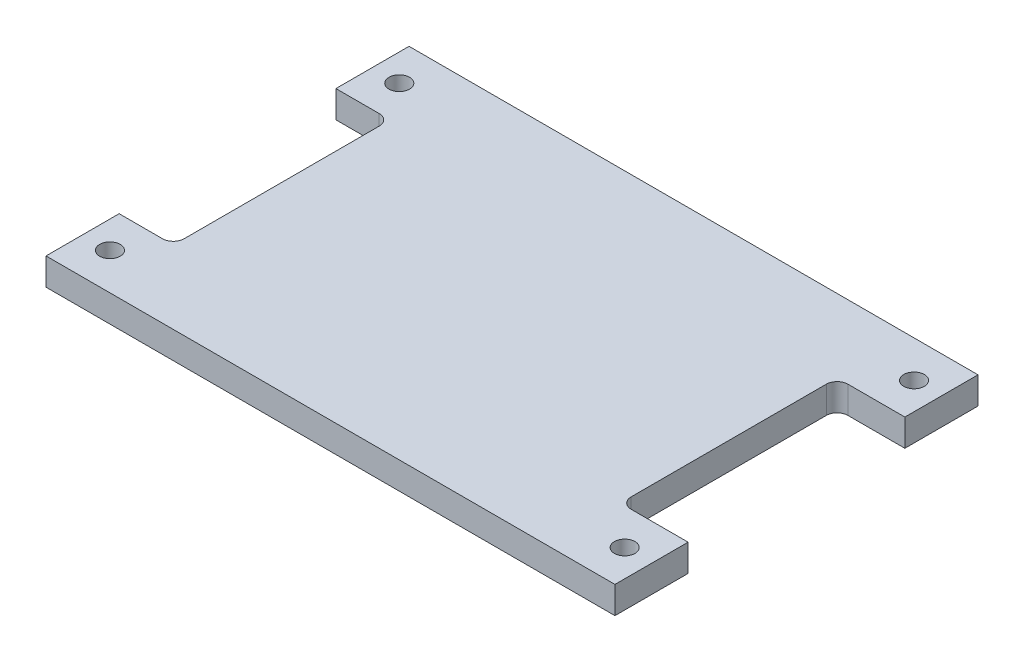
ISO-10303-21;
HEADER;
FILE_DESCRIPTION(('STEP AP214'),'2;1');
FILE_NAME('part.step','',(''),(''),'','','');
FILE_SCHEMA(('AUTOMOTIVE_DESIGN { 1 0 10303 214 1 1 1 1 }'));
ENDSEC;
DATA;
#1=APPLICATION_CONTEXT('core data for automotive mechanical design processes');
#2=APPLICATION_PROTOCOL_DEFINITION('international standard','automotive_design',2000,#1);
#3=PRODUCT_CONTEXT('',#1,'mechanical');
#4=PRODUCT('Part','Part','',(#3));
#5=PRODUCT_RELATED_PRODUCT_CATEGORY('part','',(#4));
#6=PRODUCT_DEFINITION_FORMATION('','',#4);
#7=PRODUCT_DEFINITION_CONTEXT('part definition',#1,'design');
#8=PRODUCT_DEFINITION('design','',#6,#7);
#9=PRODUCT_DEFINITION_SHAPE('','',#8);
#10=(LENGTH_UNIT() NAMED_UNIT(*) SI_UNIT(.MILLI.,.METRE.));
#11=(NAMED_UNIT(*) PLANE_ANGLE_UNIT() SI_UNIT($,.RADIAN.));
#12=(NAMED_UNIT(*) SI_UNIT($,.STERADIAN.) SOLID_ANGLE_UNIT());
#13=UNCERTAINTY_MEASURE_WITH_UNIT(LENGTH_MEASURE(1.E-05),#10,'distance_accuracy_value','');
#14=(GEOMETRIC_REPRESENTATION_CONTEXT(3) GLOBAL_UNCERTAINTY_ASSIGNED_CONTEXT((#13)) GLOBAL_UNIT_ASSIGNED_CONTEXT((#10,
#11,#12)) REPRESENTATION_CONTEXT('',''));
#15=CARTESIAN_POINT('',(0.,0.,0.));
#16=DIRECTION('',(0.,0.,1.));
#17=DIRECTION('',(1.,0.,0.));
#18=AXIS2_PLACEMENT_3D('',#15,#16,#17);
#19=CARTESIAN_POINT('',(-45.1883720930233,6.35,-47.6545348837209));
#20=DIRECTION('',(1.,0.,0.));
#21=DIRECTION('',(0.,0.,-1.));
#22=AXIS2_PLACEMENT_3D('',#19,#20,#21);
#23=PLANE('',#22);
#24=DIRECTION('',(0.,0.,1.));
#25=VECTOR('',#24,1.);
#26=CARTESIAN_POINT('',(-45.1883720930233,0.,-47.6545348837209));
#27=LINE('',#26,#25);
#28=CARTESIAN_POINT('',(-45.1883720930233,0.,-47.6545348837209));
#29=VERTEX_POINT('',#28);
#30=CARTESIAN_POINT('',(-45.1883720930233,0.,-30.5095348837209));
#31=VERTEX_POINT('',#30);
#32=EDGE_CURVE('E187',#29,#31,#27,.T.);
#33=ORIENTED_EDGE('',*,*,#32,.T.);
#34=DIRECTION('',(0.,1.,0.));
#35=VECTOR('',#34,1.);
#36=CARTESIAN_POINT('',(-45.1883720930233,0.,-30.5095348837209));
#37=LINE('',#36,#35);
#38=CARTESIAN_POINT('',(-45.1883720930233,6.35,-30.5095348837209));
#39=VERTEX_POINT('',#38);
#40=EDGE_CURVE('E275',#31,#39,#37,.T.);
#41=ORIENTED_EDGE('',*,*,#40,.T.);
#42=DIRECTION('',(0.,0.,1.));
#43=VECTOR('',#42,1.);
#44=CARTESIAN_POINT('',(-45.1883720930233,6.35,-47.6545348837209));
#45=LINE('',#44,#43);
#46=CARTESIAN_POINT('',(-45.1883720930233,6.35,-47.6545348837209));
#47=VERTEX_POINT('',#46);
#48=EDGE_CURVE('E300',#47,#39,#45,.T.);
#49=ORIENTED_EDGE('',*,*,#48,.F.);
#50=DIRECTION('',(0.,-1.,0.));
#51=VECTOR('',#50,1.);
#52=CARTESIAN_POINT('',(-45.1883720930233,6.35,-47.6545348837209));
#53=LINE('',#52,#51);
#54=EDGE_CURVE('E194',#47,#29,#53,.T.);
#55=ORIENTED_EDGE('',*,*,#54,.T.);
#56=EDGE_LOOP('',(#33,#41,#49,#55));
#57=FACE_BOUND('',#56,.T.);
#58=ADVANCED_FACE('F39',(#57),#23,.F.);
#59=CARTESIAN_POINT('',(88.1616279069767,6.35,-47.6545348837209));
#60=DIRECTION('',(-1.,0.,0.));
#61=DIRECTION('',(0.,0.,1.));
#62=AXIS2_PLACEMENT_3D('',#59,#60,#61);
#63=PLANE('',#62);
#64=DIRECTION('',(0.,0.,-1.));
#65=VECTOR('',#64,1.);
#66=CARTESIAN_POINT('',(88.1616279069767,0.,-47.6545348837209));
#67=LINE('',#66,#65);
#68=CARTESIAN_POINT('',(88.1616279069767,0.,37.4354651162791));
#69=VERTEX_POINT('',#68);
#70=CARTESIAN_POINT('',(88.1616279069767,0.,20.2904651162791));
#71=VERTEX_POINT('',#70);
#72=EDGE_CURVE('E181',#69,#71,#67,.T.);
#73=ORIENTED_EDGE('',*,*,#72,.T.);
#74=DIRECTION('',(0.,1.,0.));
#75=VECTOR('',#74,1.);
#76=CARTESIAN_POINT('',(88.1616279069767,0.,20.2904651162791));
#77=LINE('',#76,#75);
#78=CARTESIAN_POINT('',(88.1616279069767,6.35,20.2904651162791));
#79=VERTEX_POINT('',#78);
#80=EDGE_CURVE('E173',#71,#79,#77,.T.);
#81=ORIENTED_EDGE('',*,*,#80,.T.);
#82=DIRECTION('',(0.,0.,-1.));
#83=VECTOR('',#82,1.);
#84=CARTESIAN_POINT('',(88.1616279069767,6.35,-47.6545348837209));
#85=LINE('',#84,#83);
#86=CARTESIAN_POINT('',(88.1616279069767,6.35,37.4354651162791));
#87=VERTEX_POINT('',#86);
#88=EDGE_CURVE('E306',#87,#79,#85,.T.);
#89=ORIENTED_EDGE('',*,*,#88,.F.);
#90=DIRECTION('',(0.,-1.,0.));
#91=VECTOR('',#90,1.);
#92=CARTESIAN_POINT('',(88.1616279069767,6.35,37.4354651162791));
#93=LINE('',#92,#91);
#94=EDGE_CURVE('E202',#87,#69,#93,.T.);
#95=ORIENTED_EDGE('',*,*,#94,.T.);
#96=EDGE_LOOP('',(#73,#81,#89,#95));
#97=FACE_BOUND('',#96,.T.);
#98=ADVANCED_FACE('F400',(#97),#63,.F.);
#99=CARTESIAN_POINT('',(-45.1883720930233,6.35,20.2904651162791));
#100=VERTEX_POINT('',#99);
#101=CARTESIAN_POINT('',(-45.1883720930233,6.35,37.4354651162791));
#102=VERTEX_POINT('',#101);
#103=EDGE_CURVE('E193',#100,#102,#45,.T.);
#104=ORIENTED_EDGE('',*,*,#103,.F.);
#105=DIRECTION('',(0.,1.,0.));
#106=VECTOR('',#105,1.);
#107=CARTESIAN_POINT('',(-45.1883720930233,0.,20.2904651162791));
#108=LINE('',#107,#106);
#109=CARTESIAN_POINT('',(-45.1883720930233,0.,20.2904651162791));
#110=VERTEX_POINT('',#109);
#111=EDGE_CURVE('E294',#110,#100,#108,.T.);
#112=ORIENTED_EDGE('',*,*,#111,.F.);
#113=CARTESIAN_POINT('',(-45.1883720930233,0.,37.4354651162791));
#114=VERTEX_POINT('',#113);
#115=EDGE_CURVE('E312',#110,#114,#27,.T.);
#116=ORIENTED_EDGE('',*,*,#115,.T.);
#117=DIRECTION('',(0.,-1.,0.));
#118=VECTOR('',#117,1.);
#119=CARTESIAN_POINT('',(-45.1883720930233,6.35,37.4354651162791));
#120=LINE('',#119,#118);
#121=EDGE_CURVE('E206',#102,#114,#120,.T.);
#122=ORIENTED_EDGE('',*,*,#121,.F.);
#123=EDGE_LOOP('',(#104,#112,#116,#122));
#124=FACE_BOUND('',#123,.T.);
#125=ADVANCED_FACE('F402',(#124),#23,.F.);
#126=CARTESIAN_POINT('',(-45.1883720930233,6.35,37.4354651162791));
#127=DIRECTION('',(0.,0.,-1.));
#128=DIRECTION('',(-1.,0.,0.));
#129=AXIS2_PLACEMENT_3D('',#126,#127,#128);
#130=PLANE('',#129);
#131=DIRECTION('',(1.,0.,0.));
#132=VECTOR('',#131,1.);
#133=CARTESIAN_POINT('',(-45.1883720930233,0.,37.4354651162791));
#134=LINE('',#133,#132);
#135=EDGE_CURVE('E182',#114,#69,#134,.T.);
#136=ORIENTED_EDGE('',*,*,#135,.T.);
#137=ORIENTED_EDGE('',*,*,#94,.F.);
#138=DIRECTION('',(1.,0.,0.));
#139=VECTOR('',#138,1.);
#140=CARTESIAN_POINT('',(-45.1883720930233,6.35,37.4354651162791));
#141=LINE('',#140,#139);
#142=EDGE_CURVE('E303',#102,#87,#141,.T.);
#143=ORIENTED_EDGE('',*,*,#142,.F.);
#144=ORIENTED_EDGE('',*,*,#121,.T.);
#145=EDGE_LOOP('',(#136,#137,#143,#144));
#146=FACE_BOUND('',#145,.T.);
#147=ADVANCED_FACE('F410',(#146),#130,.F.);
#148=CARTESIAN_POINT('',(88.1616279069767,6.35,-30.5095348837209));
#149=VERTEX_POINT('',#148);
#150=CARTESIAN_POINT('',(88.1616279069767,6.35,-47.6545348837209));
#151=VERTEX_POINT('',#150);
#152=EDGE_CURVE('E171',#149,#151,#85,.T.);
#153=ORIENTED_EDGE('',*,*,#152,.F.);
#154=DIRECTION('',(0.,1.,0.));
#155=VECTOR('',#154,1.);
#156=CARTESIAN_POINT('',(88.1616279069767,0.,-30.5095348837209));
#157=LINE('',#156,#155);
#158=CARTESIAN_POINT('',(88.1616279069767,0.,-30.5095348837209));
#159=VERTEX_POINT('',#158);
#160=EDGE_CURVE('E155',#159,#149,#157,.T.);
#161=ORIENTED_EDGE('',*,*,#160,.F.);
#162=CARTESIAN_POINT('',(88.1616279069767,0.,-47.6545348837209));
#163=VERTEX_POINT('',#162);
#164=EDGE_CURVE('E169',#159,#163,#67,.T.);
#165=ORIENTED_EDGE('',*,*,#164,.T.);
#166=DIRECTION('',(0.,-1.,0.));
#167=VECTOR('',#166,1.);
#168=CARTESIAN_POINT('',(88.1616279069767,6.35,-47.6545348837209));
#169=LINE('',#168,#167);
#170=EDGE_CURVE('E198',#151,#163,#169,.T.);
#171=ORIENTED_EDGE('',*,*,#170,.F.);
#172=EDGE_LOOP('',(#153,#161,#165,#171));
#173=FACE_BOUND('',#172,.T.);
#174=ADVANCED_FACE('F167',(#173),#63,.F.);
#175=CARTESIAN_POINT('',(-45.1883720930233,6.35,-47.6545348837209));
#176=DIRECTION('',(0.,0.,1.));
#177=DIRECTION('',(1.,0.,0.));
#178=AXIS2_PLACEMENT_3D('',#175,#176,#177);
#179=PLANE('',#178);
#180=DIRECTION('',(-1.,0.,0.));
#181=VECTOR('',#180,1.);
#182=CARTESIAN_POINT('',(-45.1883720930233,0.,-47.6545348837209));
#183=LINE('',#182,#181);
#184=EDGE_CURVE('E179',#163,#29,#183,.T.);
#185=ORIENTED_EDGE('',*,*,#184,.T.);
#186=ORIENTED_EDGE('',*,*,#54,.F.);
#187=DIRECTION('',(-1.,0.,0.));
#188=VECTOR('',#187,1.);
#189=CARTESIAN_POINT('',(-45.1883720930233,6.35,-47.6545348837209));
#190=LINE('',#189,#188);
#191=EDGE_CURVE('E199',#151,#47,#190,.T.);
#192=ORIENTED_EDGE('',*,*,#191,.F.);
#193=ORIENTED_EDGE('',*,*,#170,.T.);
#194=EDGE_LOOP('',(#185,#186,#192,#193));
#195=FACE_BOUND('',#194,.T.);
#196=ADVANCED_FACE('F383',(#195),#179,.F.);
#197=CARTESIAN_POINT('',(0.,6.35,0.));
#198=DIRECTION('',(0.,1.,0.));
#199=DIRECTION('',(0.,0.,1.));
#200=AXIS2_PLACEMENT_3D('',#197,#198,#199);
#201=PLANE('',#200);
#202=CARTESIAN_POINT('',(81.8116279069767,6.35,28.7994651162791));
#203=DIRECTION('',(0.,1.,0.));
#204=DIRECTION('',(0.,0.,1.));
#205=AXIS2_PLACEMENT_3D('',#202,#203,#204);
#206=CIRCLE('',#205,2.413);
#207=CARTESIAN_POINT('',(81.8116279069767,6.35,31.2124651162791));
#208=VERTEX_POINT('',#207);
#209=EDGE_CURVE('E356',#208,#208,#206,.T.);
#210=ORIENTED_EDGE('',*,*,#209,.F.);
#211=EDGE_LOOP('',(#210));
#212=FACE_BOUND('',#211,.T.);
#213=CARTESIAN_POINT('',(-38.8383720930233,6.35,-39.0185348837209));
#214=DIRECTION('',(0.,1.,0.));
#215=DIRECTION('',(0.,0.,-1.));
#216=AXIS2_PLACEMENT_3D('',#213,#214,#215);
#217=CIRCLE('',#216,2.41299999999999);
#218=CARTESIAN_POINT('',(-38.8383720930233,6.35,-41.4315348837209));
#219=VERTEX_POINT('',#218);
#220=EDGE_CURVE('E347',#219,#219,#217,.T.);
#221=ORIENTED_EDGE('',*,*,#220,.F.);
#222=EDGE_LOOP('',(#221));
#223=FACE_BOUND('',#222,.T.);
#224=CARTESIAN_POINT('',(-38.8383720930233,6.35,28.7994651162791));
#225=DIRECTION('',(0.,1.,0.));
#226=DIRECTION('',(0.,0.,-1.));
#227=AXIS2_PLACEMENT_3D('',#224,#225,#226);
#228=CIRCLE('',#227,2.413);
#229=CARTESIAN_POINT('',(-38.8383720930233,6.35,26.3864651162791));
#230=VERTEX_POINT('',#229);
#231=EDGE_CURVE('E363',#230,#230,#228,.T.);
#232=ORIENTED_EDGE('',*,*,#231,.F.);
#233=EDGE_LOOP('',(#232));
#234=FACE_BOUND('',#233,.T.);
#235=CARTESIAN_POINT('',(81.8116279069767,6.35,-39.0185348837209));
#236=DIRECTION('',(0.,1.,0.));
#237=DIRECTION('',(0.,0.,1.));
#238=AXIS2_PLACEMENT_3D('',#235,#236,#237);
#239=CIRCLE('',#238,2.41299999999999);
#240=CARTESIAN_POINT('',(81.8116279069767,6.35,-36.6055348837209));
#241=VERTEX_POINT('',#240);
#242=EDGE_CURVE('E339',#241,#241,#239,.T.);
#243=ORIENTED_EDGE('',*,*,#242,.F.);
#244=EDGE_LOOP('',(#243));
#245=FACE_BOUND('',#244,.T.);
#246=DIRECTION('',(1.,0.,0.));
#247=VECTOR('',#246,1.);
#248=CARTESIAN_POINT('',(88.1616279069767,6.35,20.2904651162791));
#249=LINE('',#248,#247);
#250=CARTESIAN_POINT('',(74.8266279069768,6.35,20.2904651162791));
#251=VERTEX_POINT('',#250);
#252=EDGE_CURVE('E163',#251,#79,#249,.T.);
#253=ORIENTED_EDGE('',*,*,#252,.F.);
#254=CARTESIAN_POINT('',(74.8266279069768,6.35,17.7504651162791));
#255=DIRECTION('',(0.,1.,0.));
#256=DIRECTION('',(0.,0.,1.));
#257=AXIS2_PLACEMENT_3D('',#254,#255,#256);
#258=CIRCLE('',#257,2.54);
#259=CARTESIAN_POINT('',(72.2866279069767,6.35,17.7504651162791));
#260=VERTEX_POINT('',#259);
#261=EDGE_CURVE('E242',#251,#260,#258,.F.);
#262=ORIENTED_EDGE('',*,*,#261,.T.);
#263=DIRECTION('',(0.,0.,1.));
#264=VECTOR('',#263,1.);
#265=CARTESIAN_POINT('',(72.2866279069767,6.35,-30.5095348837209));
#266=LINE('',#265,#264);
#267=CARTESIAN_POINT('',(72.2866279069767,6.35,-27.9695348837209));
#268=VERTEX_POINT('',#267);
#269=EDGE_CURVE('E328',#268,#260,#266,.T.);
#270=ORIENTED_EDGE('',*,*,#269,.F.);
#271=CARTESIAN_POINT('',(74.8266279069768,6.35,-27.9695348837209));
#272=DIRECTION('',(0.,1.,0.));
#273=DIRECTION('',(0.,0.,1.));
#274=AXIS2_PLACEMENT_3D('',#271,#272,#273);
#275=CIRCLE('',#274,2.54);
#276=CARTESIAN_POINT('',(74.8266279069768,6.35,-30.5095348837209));
#277=VERTEX_POINT('',#276);
#278=EDGE_CURVE('E236',#268,#277,#275,.F.);
#279=ORIENTED_EDGE('',*,*,#278,.T.);
#280=DIRECTION('',(-1.,0.,0.));
#281=VECTOR('',#280,1.);
#282=CARTESIAN_POINT('',(88.1616279069767,6.35,-30.5095348837209));
#283=LINE('',#282,#281);
#284=EDGE_CURVE('E297',#149,#277,#283,.T.);
#285=ORIENTED_EDGE('',*,*,#284,.F.);
#286=ORIENTED_EDGE('',*,*,#152,.T.);
#287=ORIENTED_EDGE('',*,*,#191,.T.);
#288=ORIENTED_EDGE('',*,*,#48,.T.);
#289=DIRECTION('',(-1.,0.,0.));
#290=VECTOR('',#289,1.);
#291=CARTESIAN_POINT('',(-45.1883720930233,6.35,-30.5095348837209));
#292=LINE('',#291,#290);
#293=CARTESIAN_POINT('',(-35.0283720930233,6.35,-30.5095348837209));
#294=VERTEX_POINT('',#293);
#295=EDGE_CURVE('E262',#294,#39,#292,.T.);
#296=ORIENTED_EDGE('',*,*,#295,.F.);
#297=CARTESIAN_POINT('',(-35.0283720930233,6.35,-27.9695348837209));
#298=DIRECTION('',(0.,1.,0.));
#299=DIRECTION('',(0.,0.,1.));
#300=AXIS2_PLACEMENT_3D('',#297,#298,#299);
#301=CIRCLE('',#300,2.54);
#302=CARTESIAN_POINT('',(-32.4883720930233,6.35,-27.9695348837209));
#303=VERTEX_POINT('',#302);
#304=EDGE_CURVE('E48',#294,#303,#301,.F.);
#305=ORIENTED_EDGE('',*,*,#304,.T.);
#306=DIRECTION('',(0.,0.,-1.));
#307=VECTOR('',#306,1.);
#308=CARTESIAN_POINT('',(-32.4883720930233,6.35,-30.5095348837209));
#309=LINE('',#308,#307);
#310=CARTESIAN_POINT('',(-32.4883720930233,6.35,17.7504651162791));
#311=VERTEX_POINT('',#310);
#312=EDGE_CURVE('E260',#311,#303,#309,.T.);
#313=ORIENTED_EDGE('',*,*,#312,.F.);
#314=CARTESIAN_POINT('',(-35.0283720930233,6.35,17.7504651162791));
#315=DIRECTION('',(0.,1.,0.));
#316=DIRECTION('',(0.,0.,1.));
#317=AXIS2_PLACEMENT_3D('',#314,#315,#316);
#318=CIRCLE('',#317,2.54);
#319=CARTESIAN_POINT('',(-35.0283720930233,6.35,20.2904651162791));
#320=VERTEX_POINT('',#319);
#321=EDGE_CURVE('E248',#311,#320,#318,.F.);
#322=ORIENTED_EDGE('',*,*,#321,.T.);
#323=DIRECTION('',(1.,0.,0.));
#324=VECTOR('',#323,1.);
#325=CARTESIAN_POINT('',(-45.1883720930233,6.35,20.2904651162791));
#326=LINE('',#325,#324);
#327=EDGE_CURVE('E269',#100,#320,#326,.T.);
#328=ORIENTED_EDGE('',*,*,#327,.F.);
#329=ORIENTED_EDGE('',*,*,#103,.T.);
#330=ORIENTED_EDGE('',*,*,#142,.T.);
#331=ORIENTED_EDGE('',*,*,#88,.T.);
#332=EDGE_LOOP('',(#253,#262,#270,#279,#285,#286,#287,#288,#296,#305,#313,#322,#328,#329,#330,#331));
#333=FACE_BOUND('',#332,.T.);
#334=ADVANCED_FACE('F259',(#212,#223,#234,#245,#333),#201,.T.);
#335=CARTESIAN_POINT('',(0.,0.,0.));
#336=DIRECTION('',(0.,1.,0.));
#337=DIRECTION('',(0.,0.,1.));
#338=AXIS2_PLACEMENT_3D('',#335,#336,#337);
#339=PLANE('',#338);
#340=CARTESIAN_POINT('',(81.8116279069767,0.,28.7994651162791));
#341=DIRECTION('',(0.,1.,0.));
#342=DIRECTION('',(0.,0.,1.));
#343=AXIS2_PLACEMENT_3D('',#340,#341,#342);
#344=CIRCLE('',#343,2.413);
#345=CARTESIAN_POINT('',(81.8116279069767,0.,31.2124651162791));
#346=VERTEX_POINT('',#345);
#347=EDGE_CURVE('E343',#346,#346,#344,.T.);
#348=ORIENTED_EDGE('',*,*,#347,.T.);
#349=EDGE_LOOP('',(#348));
#350=FACE_BOUND('',#349,.T.);
#351=CARTESIAN_POINT('',(-38.8383720930233,0.,-39.0185348837209));
#352=DIRECTION('',(0.,1.,0.));
#353=DIRECTION('',(0.,0.,-1.));
#354=AXIS2_PLACEMENT_3D('',#351,#352,#353);
#355=CIRCLE('',#354,2.41299999999999);
#356=CARTESIAN_POINT('',(-38.8383720930233,0.,-41.4315348837209));
#357=VERTEX_POINT('',#356);
#358=EDGE_CURVE('E351',#357,#357,#355,.T.);
#359=ORIENTED_EDGE('',*,*,#358,.T.);
#360=EDGE_LOOP('',(#359));
#361=FACE_BOUND('',#360,.T.);
#362=CARTESIAN_POINT('',(-38.8383720930233,0.,28.7994651162791));
#363=DIRECTION('',(0.,1.,0.));
#364=DIRECTION('',(0.,0.,-1.));
#365=AXIS2_PLACEMENT_3D('',#362,#363,#364);
#366=CIRCLE('',#365,2.413);
#367=CARTESIAN_POINT('',(-38.8383720930233,0.,26.3864651162791));
#368=VERTEX_POINT('',#367);
#369=EDGE_CURVE('E352',#368,#368,#366,.T.);
#370=ORIENTED_EDGE('',*,*,#369,.T.);
#371=EDGE_LOOP('',(#370));
#372=FACE_BOUND('',#371,.T.);
#373=CARTESIAN_POINT('',(81.8116279069767,0.,-39.0185348837209));
#374=DIRECTION('',(0.,1.,0.));
#375=DIRECTION('',(0.,0.,1.));
#376=AXIS2_PLACEMENT_3D('',#373,#374,#375);
#377=CIRCLE('',#376,2.41299999999999);
#378=CARTESIAN_POINT('',(81.8116279069767,0.,-36.6055348837209));
#379=VERTEX_POINT('',#378);
#380=EDGE_CURVE('E290',#379,#379,#377,.T.);
#381=ORIENTED_EDGE('',*,*,#380,.T.);
#382=EDGE_LOOP('',(#381));
#383=FACE_BOUND('',#382,.T.);
#384=DIRECTION('',(-1.,0.,0.));
#385=VECTOR('',#384,1.);
#386=CARTESIAN_POINT('',(88.1616279069767,0.,-30.5095348837209));
#387=LINE('',#386,#385);
#388=CARTESIAN_POINT('',(74.8266279069768,0.,-30.5095348837209));
#389=VERTEX_POINT('',#388);
#390=EDGE_CURVE('E151',#159,#389,#387,.T.);
#391=ORIENTED_EDGE('',*,*,#390,.T.);
#392=CARTESIAN_POINT('',(74.8266279069768,0.,-27.9695348837209));
#393=DIRECTION('',(0.,1.,0.));
#394=DIRECTION('',(0.,0.,1.));
#395=AXIS2_PLACEMENT_3D('',#392,#393,#394);
#396=CIRCLE('',#395,2.54);
#397=CARTESIAN_POINT('',(72.2866279069767,0.,-27.9695348837209));
#398=VERTEX_POINT('',#397);
#399=EDGE_CURVE('E239',#389,#398,#396,.T.);
#400=ORIENTED_EDGE('',*,*,#399,.T.);
#401=DIRECTION('',(0.,0.,1.));
#402=VECTOR('',#401,1.);
#403=CARTESIAN_POINT('',(72.2866279069767,0.,-30.5095348837209));
#404=LINE('',#403,#402);
#405=CARTESIAN_POINT('',(72.2866279069767,0.,17.7504651162791));
#406=VERTEX_POINT('',#405);
#407=EDGE_CURVE('E162',#398,#406,#404,.T.);
#408=ORIENTED_EDGE('',*,*,#407,.T.);
#409=CARTESIAN_POINT('',(74.8266279069768,0.,17.7504651162791));
#410=DIRECTION('',(0.,1.,0.));
#411=DIRECTION('',(0.,0.,1.));
#412=AXIS2_PLACEMENT_3D('',#409,#410,#411);
#413=CIRCLE('',#412,2.54);
#414=CARTESIAN_POINT('',(74.8266279069768,0.,20.2904651162791));
#415=VERTEX_POINT('',#414);
#416=EDGE_CURVE('E245',#406,#415,#413,.T.);
#417=ORIENTED_EDGE('',*,*,#416,.T.);
#418=DIRECTION('',(1.,0.,0.));
#419=VECTOR('',#418,1.);
#420=CARTESIAN_POINT('',(88.1616279069767,0.,20.2904651162791));
#421=LINE('',#420,#419);
#422=EDGE_CURVE('E174',#415,#71,#421,.T.);
#423=ORIENTED_EDGE('',*,*,#422,.T.);
#424=ORIENTED_EDGE('',*,*,#72,.F.);
#425=ORIENTED_EDGE('',*,*,#135,.F.);
#426=ORIENTED_EDGE('',*,*,#115,.F.);
#427=DIRECTION('',(1.,0.,0.));
#428=VECTOR('',#427,1.);
#429=CARTESIAN_POINT('',(-45.1883720930233,0.,20.2904651162791));
#430=LINE('',#429,#428);
#431=CARTESIAN_POINT('',(-35.0283720930233,0.,20.2904651162791));
#432=VERTEX_POINT('',#431);
#433=EDGE_CURVE('E278',#110,#432,#430,.T.);
#434=ORIENTED_EDGE('',*,*,#433,.T.);
#435=CARTESIAN_POINT('',(-35.0283720930233,0.,17.7504651162791));
#436=DIRECTION('',(0.,1.,0.));
#437=DIRECTION('',(0.,0.,1.));
#438=AXIS2_PLACEMENT_3D('',#435,#436,#437);
#439=CIRCLE('',#438,2.54);
#440=CARTESIAN_POINT('',(-32.4883720930233,0.,17.7504651162791));
#441=VERTEX_POINT('',#440);
#442=EDGE_CURVE('E251',#432,#441,#439,.T.);
#443=ORIENTED_EDGE('',*,*,#442,.T.);
#444=DIRECTION('',(0.,0.,-1.));
#445=VECTOR('',#444,1.);
#446=CARTESIAN_POINT('',(-32.4883720930233,0.,-30.5095348837209));
#447=LINE('',#446,#445);
#448=CARTESIAN_POINT('',(-32.4883720930233,0.,-27.9695348837209));
#449=VERTEX_POINT('',#448);
#450=EDGE_CURVE('E282',#441,#449,#447,.T.);
#451=ORIENTED_EDGE('',*,*,#450,.T.);
#452=CARTESIAN_POINT('',(-35.0283720930233,0.,-27.9695348837209));
#453=DIRECTION('',(0.,1.,0.));
#454=DIRECTION('',(0.,0.,1.));
#455=AXIS2_PLACEMENT_3D('',#452,#453,#454);
#456=CIRCLE('',#455,2.54);
#457=CARTESIAN_POINT('',(-35.0283720930233,0.,-30.5095348837209));
#458=VERTEX_POINT('',#457);
#459=EDGE_CURVE('E11',#449,#458,#456,.T.);
#460=ORIENTED_EDGE('',*,*,#459,.T.);
#461=DIRECTION('',(-1.,0.,0.));
#462=VECTOR('',#461,1.);
#463=CARTESIAN_POINT('',(-45.1883720930233,0.,-30.5095348837209));
#464=LINE('',#463,#462);
#465=EDGE_CURVE('E268',#458,#31,#464,.T.);
#466=ORIENTED_EDGE('',*,*,#465,.T.);
#467=ORIENTED_EDGE('',*,*,#32,.F.);
#468=ORIENTED_EDGE('',*,*,#184,.F.);
#469=ORIENTED_EDGE('',*,*,#164,.F.);
#470=EDGE_LOOP('',(#391,#400,#408,#417,#423,#424,#425,#426,#434,#443,#451,#460,#466,#467,#468,#469));
#471=FACE_BOUND('',#470,.T.);
#472=ADVANCED_FACE('F177',(#350,#361,#372,#383,#471),#339,.F.);
#473=CARTESIAN_POINT('',(-45.1883720930233,0.,-30.5095348837209));
#474=DIRECTION('',(0.,0.,-1.));
#475=DIRECTION('',(-1.,0.,0.));
#476=AXIS2_PLACEMENT_3D('',#473,#474,#475);
#477=PLANE('',#476);
#478=ORIENTED_EDGE('',*,*,#465,.F.);
#479=DIRECTION('',(0.,1.,0.));
#480=VECTOR('',#479,1.);
#481=CARTESIAN_POINT('',(-35.0283720930233,6.35,-30.5095348837209));
#482=LINE('',#481,#480);
#483=EDGE_CURVE('E233',#458,#294,#482,.T.);
#484=ORIENTED_EDGE('',*,*,#483,.T.);
#485=ORIENTED_EDGE('',*,*,#295,.T.);
#486=ORIENTED_EDGE('',*,*,#40,.F.);
#487=EDGE_LOOP('',(#478,#484,#485,#486));
#488=FACE_BOUND('',#487,.T.);
#489=ADVANCED_FACE('F272',(#488),#477,.F.);
#490=CARTESIAN_POINT('',(-32.4883720930233,0.,-30.5095348837209));
#491=DIRECTION('',(1.,0.,0.));
#492=DIRECTION('',(0.,0.,-1.));
#493=AXIS2_PLACEMENT_3D('',#490,#491,#492);
#494=PLANE('',#493);
#495=ORIENTED_EDGE('',*,*,#450,.F.);
#496=DIRECTION('',(0.,1.,0.));
#497=VECTOR('',#496,1.);
#498=CARTESIAN_POINT('',(-32.4883720930233,6.35,17.7504651162791));
#499=LINE('',#498,#497);
#500=EDGE_CURVE('E226',#441,#311,#499,.T.);
#501=ORIENTED_EDGE('',*,*,#500,.T.);
#502=ORIENTED_EDGE('',*,*,#312,.T.);
#503=DIRECTION('',(0.,1.,0.));
#504=VECTOR('',#503,1.);
#505=CARTESIAN_POINT('',(-32.4883720930233,0.,-27.9695348837209));
#506=LINE('',#505,#504);
#507=EDGE_CURVE('E223',#303,#449,#506,.F.);
#508=ORIENTED_EDGE('',*,*,#507,.T.);
#509=EDGE_LOOP('',(#495,#501,#502,#508));
#510=FACE_BOUND('',#509,.T.);
#511=ADVANCED_FACE('F265',(#510),#494,.F.);
#512=CARTESIAN_POINT('',(-45.1883720930233,0.,20.2904651162791));
#513=DIRECTION('',(0.,0.,1.));
#514=DIRECTION('',(1.,0.,0.));
#515=AXIS2_PLACEMENT_3D('',#512,#513,#514);
#516=PLANE('',#515);
#517=ORIENTED_EDGE('',*,*,#327,.T.);
#518=DIRECTION('',(0.,1.,0.));
#519=VECTOR('',#518,1.);
#520=CARTESIAN_POINT('',(-35.0283720930233,0.,20.2904651162791));
#521=LINE('',#520,#519);
#522=EDGE_CURVE('E230',#320,#432,#521,.F.);
#523=ORIENTED_EDGE('',*,*,#522,.T.);
#524=ORIENTED_EDGE('',*,*,#433,.F.);
#525=ORIENTED_EDGE('',*,*,#111,.T.);
#526=EDGE_LOOP('',(#517,#523,#524,#525));
#527=FACE_BOUND('',#526,.T.);
#528=ADVANCED_FACE('F435',(#527),#516,.F.);
#529=CARTESIAN_POINT('',(88.1616279069767,0.,20.2904651162791));
#530=DIRECTION('',(0.,0.,1.));
#531=DIRECTION('',(1.,0.,0.));
#532=AXIS2_PLACEMENT_3D('',#529,#530,#531);
#533=PLANE('',#532);
#534=ORIENTED_EDGE('',*,*,#422,.F.);
#535=DIRECTION('',(0.,1.,0.));
#536=VECTOR('',#535,1.);
#537=CARTESIAN_POINT('',(74.8266279069768,6.35,20.2904651162791));
#538=LINE('',#537,#536);
#539=EDGE_CURVE('E219',#415,#251,#538,.T.);
#540=ORIENTED_EDGE('',*,*,#539,.T.);
#541=ORIENTED_EDGE('',*,*,#252,.T.);
#542=ORIENTED_EDGE('',*,*,#80,.F.);
#543=EDGE_LOOP('',(#534,#540,#541,#542));
#544=FACE_BOUND('',#543,.T.);
#545=ADVANCED_FACE('F438',(#544),#533,.F.);
#546=CARTESIAN_POINT('',(72.2866279069767,0.,-30.5095348837209));
#547=DIRECTION('',(-1.,0.,0.));
#548=DIRECTION('',(0.,0.,1.));
#549=AXIS2_PLACEMENT_3D('',#546,#547,#548);
#550=PLANE('',#549);
#551=ORIENTED_EDGE('',*,*,#407,.F.);
#552=DIRECTION('',(0.,1.,0.));
#553=VECTOR('',#552,1.);
#554=CARTESIAN_POINT('',(72.2866279069767,6.35,-27.9695348837209));
#555=LINE('',#554,#553);
#556=EDGE_CURVE('E213',#398,#268,#555,.T.);
#557=ORIENTED_EDGE('',*,*,#556,.T.);
#558=ORIENTED_EDGE('',*,*,#269,.T.);
#559=DIRECTION('',(0.,1.,0.));
#560=VECTOR('',#559,1.);
#561=CARTESIAN_POINT('',(72.2866279069767,0.,17.7504651162791));
#562=LINE('',#561,#560);
#563=EDGE_CURVE('E210',#260,#406,#562,.F.);
#564=ORIENTED_EDGE('',*,*,#563,.T.);
#565=EDGE_LOOP('',(#551,#557,#558,#564));
#566=FACE_BOUND('',#565,.T.);
#567=ADVANCED_FACE('F394',(#566),#550,.F.);
#568=CARTESIAN_POINT('',(88.1616279069767,0.,-30.5095348837209));
#569=DIRECTION('',(0.,0.,-1.));
#570=DIRECTION('',(-1.,0.,0.));
#571=AXIS2_PLACEMENT_3D('',#568,#569,#570);
#572=PLANE('',#571);
#573=ORIENTED_EDGE('',*,*,#284,.T.);
#574=DIRECTION('',(0.,1.,0.));
#575=VECTOR('',#574,1.);
#576=CARTESIAN_POINT('',(74.8266279069768,0.,-30.5095348837209));
#577=LINE('',#576,#575);
#578=EDGE_CURVE('E158',#277,#389,#577,.F.);
#579=ORIENTED_EDGE('',*,*,#578,.T.);
#580=ORIENTED_EDGE('',*,*,#390,.F.);
#581=ORIENTED_EDGE('',*,*,#160,.T.);
#582=EDGE_LOOP('',(#573,#579,#580,#581));
#583=FACE_BOUND('',#582,.T.);
#584=ADVANCED_FACE('F154',(#583),#572,.F.);
#585=CARTESIAN_POINT('',(81.8116279069767,0.,-39.0185348837209));
#586=DIRECTION('',(0.,1.,0.));
#587=DIRECTION('',(0.,0.,1.));
#588=AXIS2_PLACEMENT_3D('',#585,#586,#587);
#589=CYLINDRICAL_SURFACE('',#588,2.41299999999999);
#590=ORIENTED_EDGE('',*,*,#380,.F.);
#591=EDGE_LOOP('',(#590));
#592=FACE_BOUND('',#591,.T.);
#593=ORIENTED_EDGE('',*,*,#242,.T.);
#594=EDGE_LOOP('',(#593));
#595=FACE_BOUND('',#594,.T.);
#596=ADVANCED_FACE('F377',(#592,#595),#589,.F.);
#597=CARTESIAN_POINT('',(-38.8383720930233,0.,28.7994651162791));
#598=DIRECTION('',(0.,1.,0.));
#599=DIRECTION('',(0.,0.,1.));
#600=AXIS2_PLACEMENT_3D('',#597,#598,#599);
#601=CYLINDRICAL_SURFACE('',#600,2.413);
#602=ORIENTED_EDGE('',*,*,#369,.F.);
#603=EDGE_LOOP('',(#602));
#604=FACE_BOUND('',#603,.T.);
#605=ORIENTED_EDGE('',*,*,#231,.T.);
#606=EDGE_LOOP('',(#605));
#607=FACE_BOUND('',#606,.T.);
#608=ADVANCED_FACE('F373',(#604,#607),#601,.F.);
#609=CARTESIAN_POINT('',(-38.8383720930233,0.,-39.0185348837209));
#610=DIRECTION('',(0.,1.,0.));
#611=DIRECTION('',(0.,0.,1.));
#612=AXIS2_PLACEMENT_3D('',#609,#610,#611);
#613=CYLINDRICAL_SURFACE('',#612,2.41299999999999);
#614=ORIENTED_EDGE('',*,*,#358,.F.);
#615=EDGE_LOOP('',(#614));
#616=FACE_BOUND('',#615,.T.);
#617=ORIENTED_EDGE('',*,*,#220,.T.);
#618=EDGE_LOOP('',(#617));
#619=FACE_BOUND('',#618,.T.);
#620=ADVANCED_FACE('F376',(#616,#619),#613,.F.);
#621=CARTESIAN_POINT('',(81.8116279069767,0.,28.7994651162791));
#622=DIRECTION('',(0.,1.,0.));
#623=DIRECTION('',(0.,0.,1.));
#624=AXIS2_PLACEMENT_3D('',#621,#622,#623);
#625=CYLINDRICAL_SURFACE('',#624,2.413);
#626=ORIENTED_EDGE('',*,*,#347,.F.);
#627=EDGE_LOOP('',(#626));
#628=FACE_BOUND('',#627,.T.);
#629=ORIENTED_EDGE('',*,*,#209,.T.);
#630=EDGE_LOOP('',(#629));
#631=FACE_BOUND('',#630,.T.);
#632=ADVANCED_FACE('F461',(#628,#631),#625,.F.);
#633=CARTESIAN_POINT('',(74.8266279069768,0.,-27.9695348837209));
#634=DIRECTION('',(0.,-1.,0.));
#635=DIRECTION('',(0.,0.,-1.));
#636=AXIS2_PLACEMENT_3D('',#633,#634,#635);
#637=CYLINDRICAL_SURFACE('',#636,2.54);
#638=ORIENTED_EDGE('',*,*,#399,.F.);
#639=ORIENTED_EDGE('',*,*,#578,.F.);
#640=ORIENTED_EDGE('',*,*,#278,.F.);
#641=ORIENTED_EDGE('',*,*,#556,.F.);
#642=EDGE_LOOP('',(#638,#639,#640,#641));
#643=FACE_BOUND('',#642,.T.);
#644=ADVANCED_FACE('F459',(#643),#637,.F.);
#645=CARTESIAN_POINT('',(74.8266279069768,0.,17.7504651162791));
#646=DIRECTION('',(0.,-1.,0.));
#647=DIRECTION('',(0.,0.,-1.));
#648=AXIS2_PLACEMENT_3D('',#645,#646,#647);
#649=CYLINDRICAL_SURFACE('',#648,2.54);
#650=ORIENTED_EDGE('',*,*,#416,.F.);
#651=ORIENTED_EDGE('',*,*,#563,.F.);
#652=ORIENTED_EDGE('',*,*,#261,.F.);
#653=ORIENTED_EDGE('',*,*,#539,.F.);
#654=EDGE_LOOP('',(#650,#651,#652,#653));
#655=FACE_BOUND('',#654,.T.);
#656=ADVANCED_FACE('F453',(#655),#649,.F.);
#657=CARTESIAN_POINT('',(-35.0283720930233,0.,17.7504651162791));
#658=DIRECTION('',(0.,-1.,0.));
#659=DIRECTION('',(0.,0.,-1.));
#660=AXIS2_PLACEMENT_3D('',#657,#658,#659);
#661=CYLINDRICAL_SURFACE('',#660,2.54);
#662=ORIENTED_EDGE('',*,*,#442,.F.);
#663=ORIENTED_EDGE('',*,*,#522,.F.);
#664=ORIENTED_EDGE('',*,*,#321,.F.);
#665=ORIENTED_EDGE('',*,*,#500,.F.);
#666=EDGE_LOOP('',(#662,#663,#664,#665));
#667=FACE_BOUND('',#666,.T.);
#668=ADVANCED_FACE('F466',(#667),#661,.F.);
#669=CARTESIAN_POINT('',(-35.0283720930233,0.,-27.9695348837209));
#670=DIRECTION('',(0.,-1.,0.));
#671=DIRECTION('',(0.,0.,-1.));
#672=AXIS2_PLACEMENT_3D('',#669,#670,#671);
#673=CYLINDRICAL_SURFACE('',#672,2.54);
#674=ORIENTED_EDGE('',*,*,#459,.F.);
#675=ORIENTED_EDGE('',*,*,#507,.F.);
#676=ORIENTED_EDGE('',*,*,#304,.F.);
#677=ORIENTED_EDGE('',*,*,#483,.F.);
#678=EDGE_LOOP('',(#674,#675,#676,#677));
#679=FACE_BOUND('',#678,.T.);
#680=ADVANCED_FACE('F41',(#679),#673,.F.);
#681=CLOSED_SHELL('',(#58,#98,#125,#147,#174,#196,#334,#472,#489,#511,#528,#545,#567,#584,#596,
#608,#620,#632,#644,#656,#668,#680));
#682=MANIFOLD_SOLID_BREP('B2',#681);
#683=ADVANCED_BREP_SHAPE_REPRESENTATION('',(#18,#682),#14);
#684=SHAPE_DEFINITION_REPRESENTATION(#9,#683);
ENDSEC;
END-ISO-10303-21;
